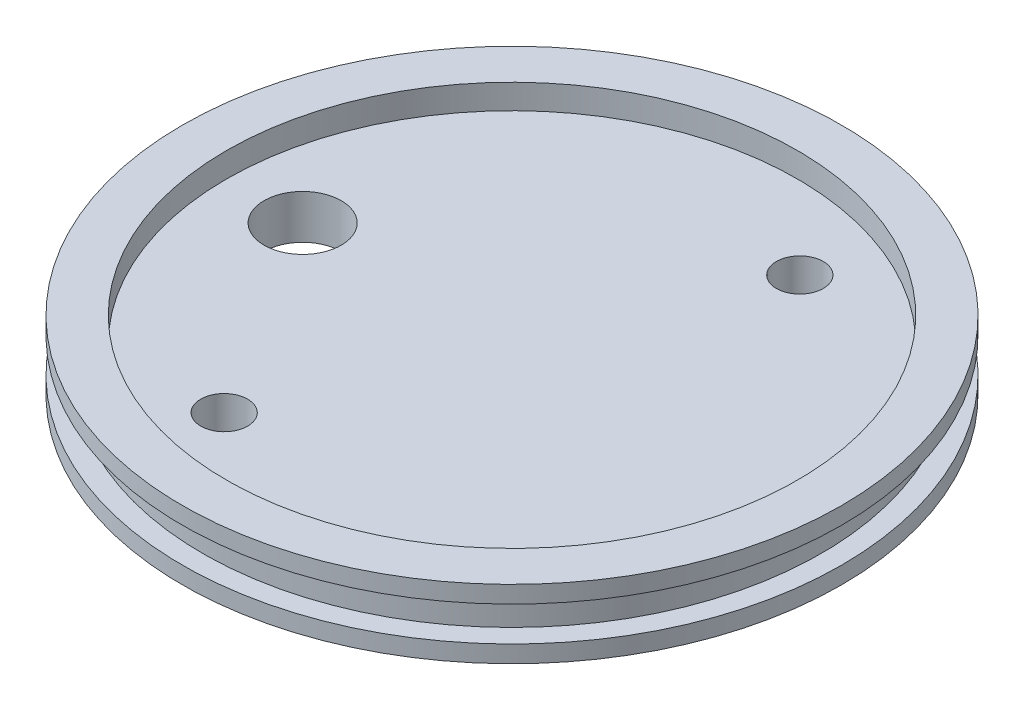
ISO-10303-21;
HEADER;
FILE_DESCRIPTION(('STEP AP214'),'2;1');
FILE_NAME('part.step','',(''),(''),'','','');
FILE_SCHEMA(('AUTOMOTIVE_DESIGN { 1 0 10303 214 1 1 1 1 }'));
ENDSEC;
DATA;
#1=APPLICATION_CONTEXT('core data for automotive mechanical design processes');
#2=APPLICATION_PROTOCOL_DEFINITION('international standard','automotive_design',2000,#1);
#3=PRODUCT_CONTEXT('',#1,'mechanical');
#4=PRODUCT('Part','Part','',(#3));
#5=PRODUCT_RELATED_PRODUCT_CATEGORY('part','',(#4));
#6=PRODUCT_DEFINITION_FORMATION('','',#4);
#7=PRODUCT_DEFINITION_CONTEXT('part definition',#1,'design');
#8=PRODUCT_DEFINITION('design','',#6,#7);
#9=PRODUCT_DEFINITION_SHAPE('','',#8);
#10=(LENGTH_UNIT() NAMED_UNIT(*) SI_UNIT(.MILLI.,.METRE.));
#11=(NAMED_UNIT(*) PLANE_ANGLE_UNIT() SI_UNIT($,.RADIAN.));
#12=(NAMED_UNIT(*) SI_UNIT($,.STERADIAN.) SOLID_ANGLE_UNIT());
#13=UNCERTAINTY_MEASURE_WITH_UNIT(LENGTH_MEASURE(1.E-05),#10,'distance_accuracy_value','');
#14=(GEOMETRIC_REPRESENTATION_CONTEXT(3) GLOBAL_UNCERTAINTY_ASSIGNED_CONTEXT((#13)) GLOBAL_UNIT_ASSIGNED_CONTEXT((#10,
#11,#12)) REPRESENTATION_CONTEXT('',''));
#15=CARTESIAN_POINT('',(0.,0.,0.));
#16=DIRECTION('',(0.,0.,1.));
#17=DIRECTION('',(1.,0.,0.));
#18=AXIS2_PLACEMENT_3D('',#15,#16,#17);
#19=CARTESIAN_POINT('',(0.,0.,0.));
#20=DIRECTION('',(0.,1.,0.));
#21=DIRECTION('',(-1.,0.,0.));
#22=AXIS2_PLACEMENT_3D('',#19,#20,#21);
#23=PLANE('',#22);
#24=CARTESIAN_POINT('',(12.1501989775917,0.,-29.3331751572333));
#25=DIRECTION('',(0.,1.,0.));
#26=DIRECTION('',(0.,0.,1.));
#27=AXIS2_PLACEMENT_3D('',#24,#25,#26);
#28=CIRCLE('',#27,3.3782);
#29=CARTESIAN_POINT('',(12.1501989775917,0.,-25.9549751572333));
#30=VERTEX_POINT('',#29);
#31=EDGE_CURVE('E74',#30,#30,#28,.T.);
#32=ORIENTED_EDGE('',*,*,#31,.T.);
#33=EDGE_LOOP('',(#32));
#34=FACE_BOUND('',#33,.T.);
#35=CARTESIAN_POINT('',(-12.1501989775917,0.,29.3331751572333));
#36=DIRECTION('',(0.,1.,0.));
#37=DIRECTION('',(0.,0.,1.));
#38=AXIS2_PLACEMENT_3D('',#35,#36,#37);
#39=CIRCLE('',#38,3.3782);
#40=CARTESIAN_POINT('',(-12.1501989775917,0.,32.7113751572333));
#41=VERTEX_POINT('',#40);
#42=EDGE_CURVE('E68',#41,#41,#39,.T.);
#43=ORIENTED_EDGE('',*,*,#42,.T.);
#44=EDGE_LOOP('',(#43));
#45=FACE_BOUND('',#44,.T.);
#46=CARTESIAN_POINT('',(-30.1752,0.,0.));
#47=DIRECTION('',(0.,1.,0.));
#48=DIRECTION('',(0.,0.,1.));
#49=AXIS2_PLACEMENT_3D('',#46,#47,#48);
#50=CIRCLE('',#49,5.5626);
#51=CARTESIAN_POINT('',(-30.1752,0.,5.5626));
#52=VERTEX_POINT('',#51);
#53=EDGE_CURVE('E62',#52,#52,#50,.T.);
#54=ORIENTED_EDGE('',*,*,#53,.T.);
#55=EDGE_LOOP('',(#54));
#56=FACE_BOUND('',#55,.T.);
#57=CARTESIAN_POINT('',(0.,0.,0.));
#58=DIRECTION('',(0.,1.,0.));
#59=DIRECTION('',(-1.,0.,0.));
#60=AXIS2_PLACEMENT_3D('',#57,#58,#59);
#61=CIRCLE('',#60,47.498);
#62=CARTESIAN_POINT('',(-47.498,0.,0.));
#63=VERTEX_POINT('',#62);
#64=EDGE_CURVE('E10',#63,#63,#61,.T.);
#65=ORIENTED_EDGE('',*,*,#64,.F.);
#66=EDGE_LOOP('',(#65));
#67=FACE_BOUND('',#66,.T.);
#68=ADVANCED_FACE('F31',(#34,#45,#56,#67),#23,.F.);
#69=CARTESIAN_POINT('',(0.,48.1922132313012,0.));
#70=DIRECTION('',(0.,1.,0.));
#71=DIRECTION('',(-1.,0.,0.));
#72=AXIS2_PLACEMENT_3D('',#69,#70,#71);
#73=CYLINDRICAL_SURFACE('',#72,47.498);
#74=CARTESIAN_POINT('',(0.,2.46379999999999,0.));
#75=DIRECTION('',(0.,1.,0.));
#76=DIRECTION('',(-1.,0.,0.));
#77=AXIS2_PLACEMENT_3D('',#74,#75,#76);
#78=CIRCLE('',#77,47.498);
#79=CARTESIAN_POINT('',(-47.498,2.46379999999998,0.));
#80=VERTEX_POINT('',#79);
#81=EDGE_CURVE('E37',#80,#80,#78,.T.);
#82=ORIENTED_EDGE('',*,*,#81,.F.);
#83=EDGE_LOOP('',(#82));
#84=FACE_BOUND('',#83,.T.);
#85=ORIENTED_EDGE('',*,*,#64,.T.);
#86=EDGE_LOOP('',(#85));
#87=FACE_BOUND('',#86,.T.);
#88=ADVANCED_FACE('F126',(#84,#87),#73,.T.);
#89=CARTESIAN_POINT('',(47.498,2.4638,0.));
#90=DIRECTION('',(0.,-1.,0.));
#91=DIRECTION('',(1.,0.,0.));
#92=AXIS2_PLACEMENT_3D('',#89,#90,#91);
#93=PLANE('',#92);
#94=CARTESIAN_POINT('',(0.,2.46379999999999,0.));
#95=DIRECTION('',(0.,1.,0.));
#96=DIRECTION('',(-1.,0.,0.));
#97=AXIS2_PLACEMENT_3D('',#94,#95,#96);
#98=CIRCLE('',#97,44.577);
#99=CARTESIAN_POINT('',(-44.577,2.46379999999998,0.));
#100=VERTEX_POINT('',#99);
#101=EDGE_CURVE('E41',#100,#100,#98,.T.);
#102=ORIENTED_EDGE('',*,*,#101,.F.);
#103=EDGE_LOOP('',(#102));
#104=FACE_BOUND('',#103,.T.);
#105=ORIENTED_EDGE('',*,*,#81,.T.);
#106=EDGE_LOOP('',(#105));
#107=FACE_BOUND('',#106,.T.);
#108=ADVANCED_FACE('F121',(#104,#107),#93,.F.);
#109=CARTESIAN_POINT('',(0.,48.1922132313012,0.));
#110=DIRECTION('',(0.,1.,0.));
#111=DIRECTION('',(-1.,0.,0.));
#112=AXIS2_PLACEMENT_3D('',#109,#110,#111);
#113=CYLINDRICAL_SURFACE('',#112,44.577);
#114=CARTESIAN_POINT('',(0.,7.44219999999999,0.));
#115=DIRECTION('',(0.,1.,0.));
#116=DIRECTION('',(-1.,0.,0.));
#117=AXIS2_PLACEMENT_3D('',#114,#115,#116);
#118=CIRCLE('',#117,44.577);
#119=CARTESIAN_POINT('',(-44.577,7.44219999999998,0.));
#120=VERTEX_POINT('',#119);
#121=EDGE_CURVE('E45',#120,#120,#118,.T.);
#122=ORIENTED_EDGE('',*,*,#121,.F.);
#123=EDGE_LOOP('',(#122));
#124=FACE_BOUND('',#123,.T.);
#125=ORIENTED_EDGE('',*,*,#101,.T.);
#126=EDGE_LOOP('',(#125));
#127=FACE_BOUND('',#126,.T.);
#128=ADVANCED_FACE('F115',(#124,#127),#113,.T.);
#129=CARTESIAN_POINT('',(44.577,7.4422,0.));
#130=DIRECTION('',(0.,1.,0.));
#131=DIRECTION('',(-1.,0.,0.));
#132=AXIS2_PLACEMENT_3D('',#129,#130,#131);
#133=PLANE('',#132);
#134=CARTESIAN_POINT('',(0.,7.44219999999999,0.));
#135=DIRECTION('',(0.,1.,0.));
#136=DIRECTION('',(-1.,0.,0.));
#137=AXIS2_PLACEMENT_3D('',#134,#135,#136);
#138=CIRCLE('',#137,47.498);
#139=CARTESIAN_POINT('',(-47.498,7.44219999999998,0.));
#140=VERTEX_POINT('',#139);
#141=EDGE_CURVE('E50',#140,#140,#138,.T.);
#142=ORIENTED_EDGE('',*,*,#141,.F.);
#143=EDGE_LOOP('',(#142));
#144=FACE_BOUND('',#143,.T.);
#145=ORIENTED_EDGE('',*,*,#121,.T.);
#146=EDGE_LOOP('',(#145));
#147=FACE_BOUND('',#146,.T.);
#148=ADVANCED_FACE('F109',(#144,#147),#133,.F.);
#149=CARTESIAN_POINT('',(0.,48.1922132313012,0.));
#150=DIRECTION('',(0.,1.,0.));
#151=DIRECTION('',(-1.,0.,0.));
#152=AXIS2_PLACEMENT_3D('',#149,#150,#151);
#153=CYLINDRICAL_SURFACE('',#152,47.498);
#154=CARTESIAN_POINT('',(0.,9.90599999999999,0.));
#155=DIRECTION('',(0.,1.,0.));
#156=DIRECTION('',(-1.,0.,0.));
#157=AXIS2_PLACEMENT_3D('',#154,#155,#156);
#158=CIRCLE('',#157,47.498);
#159=CARTESIAN_POINT('',(-47.498,9.90599999999999,0.));
#160=VERTEX_POINT('',#159);
#161=EDGE_CURVE('E53',#160,#160,#158,.T.);
#162=ORIENTED_EDGE('',*,*,#161,.F.);
#163=EDGE_LOOP('',(#162));
#164=FACE_BOUND('',#163,.T.);
#165=ORIENTED_EDGE('',*,*,#141,.T.);
#166=EDGE_LOOP('',(#165));
#167=FACE_BOUND('',#166,.T.);
#168=ADVANCED_FACE('F103',(#164,#167),#153,.T.);
#169=CARTESIAN_POINT('',(47.498,9.906,0.));
#170=DIRECTION('',(0.,-1.,0.));
#171=DIRECTION('',(1.,0.,0.));
#172=AXIS2_PLACEMENT_3D('',#169,#170,#171);
#173=PLANE('',#172);
#174=CARTESIAN_POINT('',(0.,9.90599999999999,0.));
#175=DIRECTION('',(0.,1.,0.));
#176=DIRECTION('',(-1.,0.,0.));
#177=AXIS2_PLACEMENT_3D('',#174,#175,#176);
#178=CIRCLE('',#177,41.148);
#179=CARTESIAN_POINT('',(-41.148,9.90599999999999,0.));
#180=VERTEX_POINT('',#179);
#181=EDGE_CURVE('E56',#180,#180,#178,.T.);
#182=ORIENTED_EDGE('',*,*,#181,.F.);
#183=EDGE_LOOP('',(#182));
#184=FACE_BOUND('',#183,.T.);
#185=ORIENTED_EDGE('',*,*,#161,.T.);
#186=EDGE_LOOP('',(#185));
#187=FACE_BOUND('',#186,.T.);
#188=ADVANCED_FACE('F97',(#184,#187),#173,.F.);
#189=CARTESIAN_POINT('',(0.,48.1922132313012,0.));
#190=DIRECTION('',(0.,1.,0.));
#191=DIRECTION('',(-1.,0.,0.));
#192=AXIS2_PLACEMENT_3D('',#189,#190,#191);
#193=CYLINDRICAL_SURFACE('',#192,41.148);
#194=CARTESIAN_POINT('',(0.,6.34999999999999,0.));
#195=DIRECTION('',(0.,1.,0.));
#196=DIRECTION('',(-1.,0.,0.));
#197=AXIS2_PLACEMENT_3D('',#194,#195,#196);
#198=CIRCLE('',#197,41.148);
#199=CARTESIAN_POINT('',(-41.148,6.34999999999999,0.));
#200=VERTEX_POINT('',#199);
#201=EDGE_CURVE('E59',#200,#200,#198,.T.);
#202=ORIENTED_EDGE('',*,*,#201,.F.);
#203=EDGE_LOOP('',(#202));
#204=FACE_BOUND('',#203,.T.);
#205=ORIENTED_EDGE('',*,*,#181,.T.);
#206=EDGE_LOOP('',(#205));
#207=FACE_BOUND('',#206,.T.);
#208=ADVANCED_FACE('F87',(#204,#207),#193,.F.);
#209=CARTESIAN_POINT('',(41.148,6.35,0.));
#210=DIRECTION('',(0.,-1.,0.));
#211=DIRECTION('',(1.,0.,0.));
#212=AXIS2_PLACEMENT_3D('',#209,#210,#211);
#213=PLANE('',#212);
#214=CARTESIAN_POINT('',(12.1501989775917,6.35,-29.3331751572333));
#215=DIRECTION('',(0.,1.,0.));
#216=DIRECTION('',(0.,0.,1.));
#217=AXIS2_PLACEMENT_3D('',#214,#215,#216);
#218=CIRCLE('',#217,3.3782);
#219=CARTESIAN_POINT('',(12.1501989775917,6.35,-25.9549751572333));
#220=VERTEX_POINT('',#219);
#221=EDGE_CURVE('E77',#220,#220,#218,.T.);
#222=ORIENTED_EDGE('',*,*,#221,.F.);
#223=EDGE_LOOP('',(#222));
#224=FACE_BOUND('',#223,.T.);
#225=CARTESIAN_POINT('',(-12.1501989775917,6.34999999999999,29.3331751572333));
#226=DIRECTION('',(0.,1.,0.));
#227=DIRECTION('',(0.,0.,1.));
#228=AXIS2_PLACEMENT_3D('',#225,#226,#227);
#229=CIRCLE('',#228,3.3782);
#230=CARTESIAN_POINT('',(-12.1501989775917,6.34999999999999,32.7113751572333));
#231=VERTEX_POINT('',#230);
#232=EDGE_CURVE('E71',#231,#231,#229,.T.);
#233=ORIENTED_EDGE('',*,*,#232,.F.);
#234=EDGE_LOOP('',(#233));
#235=FACE_BOUND('',#234,.T.);
#236=CARTESIAN_POINT('',(-30.1752,6.34999999999999,0.));
#237=DIRECTION('',(0.,1.,0.));
#238=DIRECTION('',(0.,0.,1.));
#239=AXIS2_PLACEMENT_3D('',#236,#237,#238);
#240=CIRCLE('',#239,5.56259999999999);
#241=CARTESIAN_POINT('',(-30.1752,6.34999999999999,5.56259999999999));
#242=VERTEX_POINT('',#241);
#243=EDGE_CURVE('E65',#242,#242,#240,.T.);
#244=ORIENTED_EDGE('',*,*,#243,.F.);
#245=EDGE_LOOP('',(#244));
#246=FACE_BOUND('',#245,.T.);
#247=ORIENTED_EDGE('',*,*,#201,.T.);
#248=EDGE_LOOP('',(#247));
#249=FACE_BOUND('',#248,.T.);
#250=ADVANCED_FACE('F83',(#224,#235,#246,#249),#213,.F.);
#251=CARTESIAN_POINT('',(-30.1752,6.34999999999999,0.));
#252=DIRECTION('',(0.,1.,0.));
#253=DIRECTION('',(0.,0.,1.));
#254=AXIS2_PLACEMENT_3D('',#251,#252,#253);
#255=CYLINDRICAL_SURFACE('',#254,5.56259999999999);
#256=ORIENTED_EDGE('',*,*,#53,.F.);
#257=EDGE_LOOP('',(#256));
#258=FACE_BOUND('',#257,.T.);
#259=ORIENTED_EDGE('',*,*,#243,.T.);
#260=EDGE_LOOP('',(#259));
#261=FACE_BOUND('',#260,.T.);
#262=ADVANCED_FACE('F86',(#258,#261),#255,.F.);
#263=CARTESIAN_POINT('',(-12.1501989775917,6.34999999999999,29.3331751572333));
#264=DIRECTION('',(0.,1.,0.));
#265=DIRECTION('',(0.,0.,1.));
#266=AXIS2_PLACEMENT_3D('',#263,#264,#265);
#267=CYLINDRICAL_SURFACE('',#266,3.3782);
#268=ORIENTED_EDGE('',*,*,#42,.F.);
#269=EDGE_LOOP('',(#268));
#270=FACE_BOUND('',#269,.T.);
#271=ORIENTED_EDGE('',*,*,#232,.T.);
#272=EDGE_LOOP('',(#271));
#273=FACE_BOUND('',#272,.T.);
#274=ADVANCED_FACE('F145',(#270,#273),#267,.F.);
#275=CARTESIAN_POINT('',(12.1501989775917,6.35,-29.3331751572333));
#276=DIRECTION('',(0.,1.,0.));
#277=DIRECTION('',(0.,0.,1.));
#278=AXIS2_PLACEMENT_3D('',#275,#276,#277);
#279=CYLINDRICAL_SURFACE('',#278,3.3782);
#280=ORIENTED_EDGE('',*,*,#31,.F.);
#281=EDGE_LOOP('',(#280));
#282=FACE_BOUND('',#281,.T.);
#283=ORIENTED_EDGE('',*,*,#221,.T.);
#284=EDGE_LOOP('',(#283));
#285=FACE_BOUND('',#284,.T.);
#286=ADVANCED_FACE('F81',(#282,#285),#279,.F.);
#287=CLOSED_SHELL('',(#68,#88,#108,#128,#148,#168,#188,#208,#250,#262,#274,#286));
#288=MANIFOLD_SOLID_BREP('B2',#287);
#289=ADVANCED_BREP_SHAPE_REPRESENTATION('',(#18,#288),#14);
#290=SHAPE_DEFINITION_REPRESENTATION(#9,#289);
ENDSEC;
END-ISO-10303-21;
